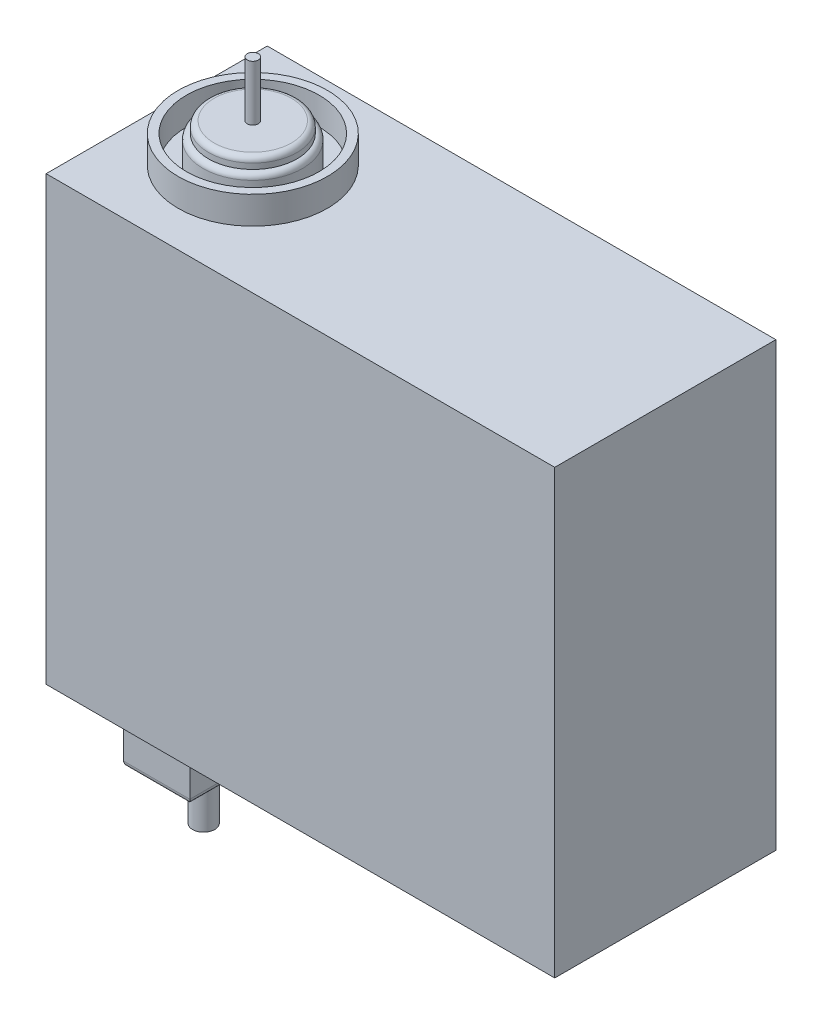
ISO-10303-21;
HEADER;
FILE_DESCRIPTION(('STEP AP214'),'2;1');
FILE_NAME('part.step','',(''),(''),'','','');
FILE_SCHEMA(('AUTOMOTIVE_DESIGN { 1 0 10303 214 1 1 1 1 }'));
ENDSEC;
DATA;
#1=APPLICATION_CONTEXT('core data for automotive mechanical design processes');
#2=APPLICATION_PROTOCOL_DEFINITION('international standard','automotive_design',2000,#1);
#3=PRODUCT_CONTEXT('',#1,'mechanical');
#4=PRODUCT('Part','Part','',(#3));
#5=PRODUCT_RELATED_PRODUCT_CATEGORY('part','',(#4));
#6=PRODUCT_DEFINITION_FORMATION('','',#4);
#7=PRODUCT_DEFINITION_CONTEXT('part definition',#1,'design');
#8=PRODUCT_DEFINITION('design','',#6,#7);
#9=PRODUCT_DEFINITION_SHAPE('','',#8);
#10=(LENGTH_UNIT() NAMED_UNIT(*) SI_UNIT(.MILLI.,.METRE.));
#11=(NAMED_UNIT(*) PLANE_ANGLE_UNIT() SI_UNIT($,.RADIAN.));
#12=(NAMED_UNIT(*) SI_UNIT($,.STERADIAN.) SOLID_ANGLE_UNIT());
#13=UNCERTAINTY_MEASURE_WITH_UNIT(LENGTH_MEASURE(1.E-05),#10,'distance_accuracy_value','');
#14=(GEOMETRIC_REPRESENTATION_CONTEXT(3) GLOBAL_UNCERTAINTY_ASSIGNED_CONTEXT((#13)) GLOBAL_UNIT_ASSIGNED_CONTEXT((#10,
#11,#12)) REPRESENTATION_CONTEXT('',''));
#15=CARTESIAN_POINT('',(0.,0.,0.));
#16=DIRECTION('',(0.,0.,1.));
#17=DIRECTION('',(1.,0.,0.));
#18=AXIS2_PLACEMENT_3D('',#15,#16,#17);
#19=CARTESIAN_POINT('',(0.,-5.,0.));
#20=DIRECTION('',(0.,-1.,0.));
#21=DIRECTION('',(0.,0.,-1.));
#22=AXIS2_PLACEMENT_3D('',#19,#20,#21);
#23=PLANE('',#22);
#24=CARTESIAN_POINT('',(-46.1813750086827,-5.,-13.2208172056496));
#25=DIRECTION('',(0.,-1.,0.));
#26=DIRECTION('',(0.,0.,-1.));
#27=AXIS2_PLACEMENT_3D('',#24,#25,#26);
#28=CIRCLE('',#27,0.999999999999998);
#29=CARTESIAN_POINT('',(-46.1813750086827,-5.,-14.2208172056496));
#30=VERTEX_POINT('',#29);
#31=EDGE_CURVE('E252',#30,#30,#28,.T.);
#32=ORIENTED_EDGE('',*,*,#31,.F.);
#33=EDGE_LOOP('',(#32));
#34=FACE_BOUND('',#33,.T.);
#35=DIRECTION('',(0.,0.,1.));
#36=VECTOR('',#35,1.);
#37=CARTESIAN_POINT('',(-43.6813750086827,-5.,-8.97081720564958));
#38=LINE('',#37,#36);
#39=CARTESIAN_POINT('',(-43.6813750086827,-5.,-24.4708172056496));
#40=VERTEX_POINT('',#39);
#41=CARTESIAN_POINT('',(-43.6813750086827,-5.,-9.47081720564958));
#42=VERTEX_POINT('',#41);
#43=EDGE_CURVE('E218',#40,#42,#38,.T.);
#44=ORIENTED_EDGE('',*,*,#43,.T.);
#45=DIRECTION('',(-1.,0.,0.));
#46=VECTOR('',#45,1.);
#47=CARTESIAN_POINT('',(-49.1813750086827,-5.,-9.47081720564958));
#48=LINE('',#47,#46);
#49=CARTESIAN_POINT('',(-48.6813750086827,-5.,-9.47081720564958));
#50=VERTEX_POINT('',#49);
#51=EDGE_CURVE('E220',#42,#50,#48,.T.);
#52=ORIENTED_EDGE('',*,*,#51,.T.);
#53=DIRECTION('',(0.,0.,-1.));
#54=VECTOR('',#53,1.);
#55=CARTESIAN_POINT('',(-48.6813750086827,-5.,-24.9708172056496));
#56=LINE('',#55,#54);
#57=CARTESIAN_POINT('',(-48.6813750086827,-5.,-24.4708172056496));
#58=VERTEX_POINT('',#57);
#59=EDGE_CURVE('E214',#50,#58,#56,.T.);
#60=ORIENTED_EDGE('',*,*,#59,.T.);
#61=DIRECTION('',(1.,0.,0.));
#62=VECTOR('',#61,1.);
#63=CARTESIAN_POINT('',(-43.1813750086827,-5.,-24.4708172056496));
#64=LINE('',#63,#62);
#65=EDGE_CURVE('E216',#58,#40,#64,.T.);
#66=ORIENTED_EDGE('',*,*,#65,.T.);
#67=EDGE_LOOP('',(#44,#52,#60,#66));
#68=FACE_BOUND('',#67,.T.);
#69=CARTESIAN_POINT('',(-46.1813750086827,-5.,-20.7208172056496));
#70=DIRECTION('',(0.,-1.,0.));
#71=DIRECTION('',(0.,0.,-1.));
#72=AXIS2_PLACEMENT_3D('',#69,#70,#71);
#73=CIRCLE('',#72,0.999999999999998);
#74=CARTESIAN_POINT('',(-46.1813750086827,-5.,-21.7208172056496));
#75=VERTEX_POINT('',#74);
#76=EDGE_CURVE('E258',#75,#75,#73,.T.);
#77=ORIENTED_EDGE('',*,*,#76,.F.);
#78=EDGE_LOOP('',(#77));
#79=FACE_BOUND('',#78,.T.);
#80=ADVANCED_FACE('F41',(#34,#68,#79),#23,.T.);
#81=CARTESIAN_POINT('',(0.,0.,0.));
#82=DIRECTION('',(0.,1.,0.));
#83=DIRECTION('',(0.,0.,1.));
#84=AXIS2_PLACEMENT_3D('',#81,#82,#83);
#85=PLANE('',#84);
#86=DIRECTION('',(0.,0.,1.));
#87=VECTOR('',#86,1.);
#88=CARTESIAN_POINT('',(-54.1813750086827,0.,-26.9708172056496));
#89=LINE('',#88,#87);
#90=CARTESIAN_POINT('',(-54.1813750086827,0.,-26.9708172056496));
#91=VERTEX_POINT('',#90);
#92=CARTESIAN_POINT('',(-54.1813750086827,0.,-6.97081720564958));
#93=VERTEX_POINT('',#92);
#94=EDGE_CURVE('E172',#91,#93,#89,.T.);
#95=ORIENTED_EDGE('',*,*,#94,.F.);
#96=DIRECTION('',(-1.,0.,0.));
#97=VECTOR('',#96,1.);
#98=CARTESIAN_POINT('',(-54.1813750086827,0.,-26.9708172056496));
#99=LINE('',#98,#97);
#100=CARTESIAN_POINT('',(-8.18137500868274,0.,-26.9708172056496));
#101=VERTEX_POINT('',#100);
#102=EDGE_CURVE('E177',#101,#91,#99,.T.);
#103=ORIENTED_EDGE('',*,*,#102,.F.);
#104=DIRECTION('',(0.,0.,-1.));
#105=VECTOR('',#104,1.);
#106=CARTESIAN_POINT('',(-8.18137500868274,0.,-26.9708172056496));
#107=LINE('',#106,#105);
#108=CARTESIAN_POINT('',(-8.18137500868273,0.,-6.97081720564958));
#109=VERTEX_POINT('',#108);
#110=EDGE_CURVE('E188',#109,#101,#107,.T.);
#111=ORIENTED_EDGE('',*,*,#110,.F.);
#112=DIRECTION('',(1.,0.,0.));
#113=VECTOR('',#112,1.);
#114=CARTESIAN_POINT('',(-54.1813750086827,0.,-6.97081720564958));
#115=LINE('',#114,#113);
#116=EDGE_CURVE('E186',#93,#109,#115,.T.);
#117=ORIENTED_EDGE('',*,*,#116,.F.);
#118=EDGE_LOOP('',(#95,#103,#111,#117));
#119=FACE_BOUND('',#118,.T.);
#120=DIRECTION('',(0.,0.,-1.));
#121=VECTOR('',#120,1.);
#122=CARTESIAN_POINT('',(-49.1813750086827,0.,-8.97081720564958));
#123=LINE('',#122,#121);
#124=CARTESIAN_POINT('',(-49.1813750086827,0.,-8.97081720564958));
#125=VERTEX_POINT('',#124);
#126=CARTESIAN_POINT('',(-49.1813750086827,0.,-24.9708172056496));
#127=VERTEX_POINT('',#126);
#128=EDGE_CURVE('E122',#125,#127,#123,.T.);
#129=ORIENTED_EDGE('',*,*,#128,.F.);
#130=DIRECTION('',(-1.,0.,0.));
#131=VECTOR('',#130,1.);
#132=CARTESIAN_POINT('',(-49.1813750086827,0.,-8.97081720564958));
#133=LINE('',#132,#131);
#134=CARTESIAN_POINT('',(-43.1813750086827,0.,-8.97081720564958));
#135=VERTEX_POINT('',#134);
#136=EDGE_CURVE('E129',#135,#125,#133,.T.);
#137=ORIENTED_EDGE('',*,*,#136,.F.);
#138=DIRECTION('',(0.,0.,1.));
#139=VECTOR('',#138,1.);
#140=CARTESIAN_POINT('',(-43.1813750086827,0.,-8.97081720564958));
#141=LINE('',#140,#139);
#142=CARTESIAN_POINT('',(-43.1813750086827,0.,-24.9708172056496));
#143=VERTEX_POINT('',#142);
#144=EDGE_CURVE('E141',#143,#135,#141,.T.);
#145=ORIENTED_EDGE('',*,*,#144,.F.);
#146=DIRECTION('',(1.,0.,0.));
#147=VECTOR('',#146,1.);
#148=CARTESIAN_POINT('',(-49.1813750086827,0.,-24.9708172056496));
#149=LINE('',#148,#147);
#150=EDGE_CURVE('E138',#127,#143,#149,.T.);
#151=ORIENTED_EDGE('',*,*,#150,.F.);
#152=EDGE_LOOP('',(#129,#137,#145,#151));
#153=FACE_BOUND('',#152,.T.);
#154=ADVANCED_FACE('F134',(#119,#153),#85,.F.);
#155=CARTESIAN_POINT('',(-45.4895583516191,43.5,-16.9708172056496));
#156=DIRECTION('',(0.,1.,0.));
#157=DIRECTION('',(0.,0.,1.));
#158=AXIS2_PLACEMENT_3D('',#155,#156,#157);
#159=PLANE('',#158);
#160=CARTESIAN_POINT('',(-45.4895583516191,43.5,-16.9708172056496));
#161=DIRECTION('',(0.,1.,0.));
#162=DIRECTION('',(0.,0.,1.));
#163=AXIS2_PLACEMENT_3D('',#160,#161,#162);
#164=CIRCLE('',#163,3.50000000000001);
#165=CARTESIAN_POINT('',(-45.4895583516191,43.5,-13.4708172056496));
#166=VERTEX_POINT('',#165);
#167=EDGE_CURVE('E205',#166,#166,#164,.T.);
#168=ORIENTED_EDGE('',*,*,#167,.T.);
#169=EDGE_LOOP('',(#168));
#170=FACE_BOUND('',#169,.T.);
#171=CARTESIAN_POINT('',(-45.4895583516191,43.5,-16.9708172056496));
#172=DIRECTION('',(0.,1.,0.));
#173=DIRECTION('',(0.,0.,1.));
#174=AXIS2_PLACEMENT_3D('',#171,#172,#173);
#175=CIRCLE('',#174,0.499999999999999);
#176=CARTESIAN_POINT('',(-45.4895583516191,43.5,-16.4708172056496));
#177=VERTEX_POINT('',#176);
#178=EDGE_CURVE('E151',#177,#177,#175,.T.);
#179=ORIENTED_EDGE('',*,*,#178,.F.);
#180=EDGE_LOOP('',(#179));
#181=FACE_BOUND('',#180,.T.);
#182=ADVANCED_FACE('F279',(#170,#181),#159,.T.);
#183=CARTESIAN_POINT('',(0.,40.,0.));
#184=DIRECTION('',(0.,1.,0.));
#185=DIRECTION('',(0.,0.,1.));
#186=AXIS2_PLACEMENT_3D('',#183,#184,#185);
#187=PLANE('',#186);
#188=CARTESIAN_POINT('',(-45.4895583516191,40.,-16.9708172056496));
#189=DIRECTION('',(0.,1.,0.));
#190=DIRECTION('',(0.,0.,1.));
#191=AXIS2_PLACEMENT_3D('',#188,#189,#190);
#192=CIRCLE('',#191,6.);
#193=CARTESIAN_POINT('',(-45.4895583516191,40.,-10.9708172056496));
#194=VERTEX_POINT('',#193);
#195=EDGE_CURVE('E202',#194,#194,#192,.F.);
#196=ORIENTED_EDGE('',*,*,#195,.F.);
#197=EDGE_LOOP('',(#196));
#198=FACE_BOUND('',#197,.T.);
#199=CARTESIAN_POINT('',(-45.4895583516191,40.,-16.9708172056496));
#200=DIRECTION('',(0.,1.,0.));
#201=DIRECTION('',(0.,0.,1.));
#202=AXIS2_PLACEMENT_3D('',#199,#200,#201);
#203=CIRCLE('',#202,4.5);
#204=CARTESIAN_POINT('',(-45.4895583516191,40.,-12.4708172056496));
#205=VERTEX_POINT('',#204);
#206=EDGE_CURVE('E167',#205,#205,#203,.T.);
#207=ORIENTED_EDGE('',*,*,#206,.F.);
#208=EDGE_LOOP('',(#207));
#209=FACE_BOUND('',#208,.T.);
#210=ADVANCED_FACE('F307',(#198,#209),#187,.T.);
#211=CARTESIAN_POINT('',(-45.4895583516191,42.5,-16.9708172056496));
#212=DIRECTION('',(0.,-1.,0.));
#213=DIRECTION('',(0.,0.,-1.));
#214=AXIS2_PLACEMENT_3D('',#211,#212,#213);
#215=CYLINDRICAL_SURFACE('',#214,4.5);
#216=CARTESIAN_POINT('',(-45.4895583516191,42.,-16.9708172056496));
#217=DIRECTION('',(0.,1.,0.));
#218=DIRECTION('',(0.,0.,1.));
#219=AXIS2_PLACEMENT_3D('',#216,#217,#218);
#220=CIRCLE('',#219,4.5);
#221=CARTESIAN_POINT('',(-45.4895583516191,42.,-12.4708172056496));
#222=VERTEX_POINT('',#221);
#223=EDGE_CURVE('E211',#222,#222,#220,.F.);
#224=ORIENTED_EDGE('',*,*,#223,.T.);
#225=EDGE_LOOP('',(#224));
#226=FACE_BOUND('',#225,.T.);
#227=ORIENTED_EDGE('',*,*,#206,.T.);
#228=EDGE_LOOP('',(#227));
#229=FACE_BOUND('',#228,.T.);
#230=ADVANCED_FACE('F327',(#226,#229),#215,.T.);
#231=CARTESIAN_POINT('',(-45.4895583516191,42.5,-16.9708172056496));
#232=DIRECTION('',(0.,-1.,0.));
#233=DIRECTION('',(0.,0.,-1.));
#234=AXIS2_PLACEMENT_3D('',#231,#232,#233);
#235=CYLINDRICAL_SURFACE('',#234,6.);
#236=CARTESIAN_POINT('',(-45.4895583516191,42.5,-16.9708172056496));
#237=DIRECTION('',(0.,1.,0.));
#238=DIRECTION('',(0.,0.,1.));
#239=AXIS2_PLACEMENT_3D('',#236,#237,#238);
#240=CIRCLE('',#239,6.);
#241=CARTESIAN_POINT('',(-45.4895583516191,42.5,-10.9708172056496));
#242=VERTEX_POINT('',#241);
#243=EDGE_CURVE('E161',#242,#242,#240,.T.);
#244=ORIENTED_EDGE('',*,*,#243,.T.);
#245=EDGE_LOOP('',(#244));
#246=FACE_BOUND('',#245,.T.);
#247=ORIENTED_EDGE('',*,*,#195,.T.);
#248=EDGE_LOOP('',(#247));
#249=FACE_BOUND('',#248,.T.);
#250=ADVANCED_FACE('F323',(#246,#249),#235,.F.);
#251=CARTESIAN_POINT('',(-45.4895583516191,42.5,-16.9708172056496));
#252=DIRECTION('',(0.,-1.,0.));
#253=DIRECTION('',(0.,0.,-1.));
#254=AXIS2_PLACEMENT_3D('',#251,#252,#253);
#255=CYLINDRICAL_SURFACE('',#254,6.75);
#256=CARTESIAN_POINT('',(-45.4895583516191,42.5,-16.9708172056496));
#257=DIRECTION('',(0.,1.,0.));
#258=DIRECTION('',(0.,0.,1.));
#259=AXIS2_PLACEMENT_3D('',#256,#257,#258);
#260=CIRCLE('',#259,6.75);
#261=CARTESIAN_POINT('',(-45.4895583516191,42.5,-10.2208172056496));
#262=VERTEX_POINT('',#261);
#263=EDGE_CURVE('E164',#262,#262,#260,.T.);
#264=ORIENTED_EDGE('',*,*,#263,.F.);
#265=EDGE_LOOP('',(#264));
#266=FACE_BOUND('',#265,.T.);
#267=CARTESIAN_POINT('',(-45.4895583516191,40.,-16.9708172056496));
#268=DIRECTION('',(0.,1.,0.));
#269=DIRECTION('',(0.,0.,1.));
#270=AXIS2_PLACEMENT_3D('',#267,#268,#269);
#271=CIRCLE('',#270,6.75);
#272=CARTESIAN_POINT('',(-45.4895583516191,40.,-10.2208172056496));
#273=VERTEX_POINT('',#272);
#274=EDGE_CURVE('E160',#273,#273,#271,.T.);
#275=ORIENTED_EDGE('',*,*,#274,.T.);
#276=EDGE_LOOP('',(#275));
#277=FACE_BOUND('',#276,.T.);
#278=ADVANCED_FACE('F319',(#266,#277),#255,.T.);
#279=CARTESIAN_POINT('',(0.,42.5,0.));
#280=DIRECTION('',(0.,1.,0.));
#281=DIRECTION('',(0.,0.,1.));
#282=AXIS2_PLACEMENT_3D('',#279,#280,#281);
#283=PLANE('',#282);
#284=ORIENTED_EDGE('',*,*,#243,.F.);
#285=EDGE_LOOP('',(#284));
#286=FACE_BOUND('',#285,.T.);
#287=ORIENTED_EDGE('',*,*,#263,.T.);
#288=EDGE_LOOP('',(#287));
#289=FACE_BOUND('',#288,.T.);
#290=ADVANCED_FACE('F315',(#286,#289),#283,.T.);
#291=CARTESIAN_POINT('',(-54.1813750086827,40.,-26.9708172056496));
#292=DIRECTION('',(0.,0.,1.));
#293=DIRECTION('',(1.,0.,0.));
#294=AXIS2_PLACEMENT_3D('',#291,#292,#293);
#295=PLANE('',#294);
#296=ORIENTED_EDGE('',*,*,#102,.T.);
#297=DIRECTION('',(0.,-1.,0.));
#298=VECTOR('',#297,1.);
#299=CARTESIAN_POINT('',(-54.1813750086827,40.,-26.9708172056496));
#300=LINE('',#299,#298);
#301=CARTESIAN_POINT('',(-54.1813750086827,40.,-26.9708172056496));
#302=VERTEX_POINT('',#301);
#303=EDGE_CURVE('E183',#302,#91,#300,.T.);
#304=ORIENTED_EDGE('',*,*,#303,.F.);
#305=DIRECTION('',(-1.,0.,0.));
#306=VECTOR('',#305,1.);
#307=CARTESIAN_POINT('',(-54.1813750086827,40.,-26.9708172056496));
#308=LINE('',#307,#306);
#309=CARTESIAN_POINT('',(-8.18137500868274,40.,-26.9708172056496));
#310=VERTEX_POINT('',#309);
#311=EDGE_CURVE('E181',#310,#302,#308,.T.);
#312=ORIENTED_EDGE('',*,*,#311,.F.);
#313=DIRECTION('',(0.,-1.,0.));
#314=VECTOR('',#313,1.);
#315=CARTESIAN_POINT('',(-8.18137500868274,40.,-26.9708172056496));
#316=LINE('',#315,#314);
#317=EDGE_CURVE('E193',#310,#101,#316,.T.);
#318=ORIENTED_EDGE('',*,*,#317,.T.);
#319=EDGE_LOOP('',(#296,#304,#312,#318));
#320=FACE_BOUND('',#319,.T.);
#321=ADVANCED_FACE('F318',(#320),#295,.F.);
#322=CARTESIAN_POINT('',(-8.18137500868274,40.,-26.9708172056496));
#323=DIRECTION('',(-1.,0.,0.));
#324=DIRECTION('',(0.,0.,1.));
#325=AXIS2_PLACEMENT_3D('',#322,#323,#324);
#326=PLANE('',#325);
#327=ORIENTED_EDGE('',*,*,#110,.T.);
#328=ORIENTED_EDGE('',*,*,#317,.F.);
#329=DIRECTION('',(0.,0.,-1.));
#330=VECTOR('',#329,1.);
#331=CARTESIAN_POINT('',(-8.18137500868274,40.,-26.9708172056496));
#332=LINE('',#331,#330);
#333=CARTESIAN_POINT('',(-8.18137500868273,40.,-6.97081720564958));
#334=VERTEX_POINT('',#333);
#335=EDGE_CURVE('E179',#334,#310,#332,.T.);
#336=ORIENTED_EDGE('',*,*,#335,.F.);
#337=DIRECTION('',(0.,-1.,0.));
#338=VECTOR('',#337,1.);
#339=CARTESIAN_POINT('',(-8.18137500868273,40.,-6.97081720564958));
#340=LINE('',#339,#338);
#341=EDGE_CURVE('E196',#334,#109,#340,.T.);
#342=ORIENTED_EDGE('',*,*,#341,.T.);
#343=EDGE_LOOP('',(#327,#328,#336,#342));
#344=FACE_BOUND('',#343,.T.);
#345=ADVANCED_FACE('F337',(#344),#326,.F.);
#346=CARTESIAN_POINT('',(-54.1813750086827,40.,-6.97081720564958));
#347=DIRECTION('',(0.,0.,-1.));
#348=DIRECTION('',(-1.,0.,0.));
#349=AXIS2_PLACEMENT_3D('',#346,#347,#348);
#350=PLANE('',#349);
#351=ORIENTED_EDGE('',*,*,#116,.T.);
#352=ORIENTED_EDGE('',*,*,#341,.F.);
#353=DIRECTION('',(1.,0.,0.));
#354=VECTOR('',#353,1.);
#355=CARTESIAN_POINT('',(-54.1813750086827,40.,-6.97081720564958));
#356=LINE('',#355,#354);
#357=CARTESIAN_POINT('',(-54.1813750086827,40.,-6.97081720564958));
#358=VERTEX_POINT('',#357);
#359=EDGE_CURVE('E176',#358,#334,#356,.T.);
#360=ORIENTED_EDGE('',*,*,#359,.F.);
#361=DIRECTION('',(0.,-1.,0.));
#362=VECTOR('',#361,1.);
#363=CARTESIAN_POINT('',(-54.1813750086827,40.,-6.97081720564958));
#364=LINE('',#363,#362);
#365=EDGE_CURVE('E199',#358,#93,#364,.T.);
#366=ORIENTED_EDGE('',*,*,#365,.T.);
#367=EDGE_LOOP('',(#351,#352,#360,#366));
#368=FACE_BOUND('',#367,.T.);
#369=ADVANCED_FACE('F341',(#368),#350,.F.);
#370=CARTESIAN_POINT('',(-54.1813750086827,40.,-26.9708172056496));
#371=DIRECTION('',(1.,0.,0.));
#372=DIRECTION('',(0.,0.,-1.));
#373=AXIS2_PLACEMENT_3D('',#370,#371,#372);
#374=PLANE('',#373);
#375=ORIENTED_EDGE('',*,*,#94,.T.);
#376=ORIENTED_EDGE('',*,*,#365,.F.);
#377=DIRECTION('',(0.,0.,1.));
#378=VECTOR('',#377,1.);
#379=CARTESIAN_POINT('',(-54.1813750086827,40.,-26.9708172056496));
#380=LINE('',#379,#378);
#381=EDGE_CURVE('E173',#302,#358,#380,.T.);
#382=ORIENTED_EDGE('',*,*,#381,.F.);
#383=ORIENTED_EDGE('',*,*,#303,.T.);
#384=EDGE_LOOP('',(#375,#376,#382,#383));
#385=FACE_BOUND('',#384,.T.);
#386=ADVANCED_FACE('F345',(#385),#374,.F.);
#387=ORIENTED_EDGE('',*,*,#381,.T.);
#388=ORIENTED_EDGE('',*,*,#359,.T.);
#389=ORIENTED_EDGE('',*,*,#335,.T.);
#390=ORIENTED_EDGE('',*,*,#311,.T.);
#391=EDGE_LOOP('',(#387,#388,#389,#390));
#392=FACE_BOUND('',#391,.T.);
#393=ORIENTED_EDGE('',*,*,#274,.F.);
#394=EDGE_LOOP('',(#393));
#395=FACE_BOUND('',#394,.T.);
#396=ADVANCED_FACE('F313',(#392,#395),#187,.T.);
#397=CARTESIAN_POINT('',(-45.4895583516191,43.5,-16.9708172056496));
#398=DIRECTION('',(0.,-1.,0.));
#399=DIRECTION('',(0.,0.,-1.));
#400=AXIS2_PLACEMENT_3D('',#397,#398,#399);
#401=CYLINDRICAL_SURFACE('',#400,4.00000000000001);
#402=CARTESIAN_POINT('',(-45.4895583516191,43.,-16.9708172056496));
#403=DIRECTION('',(0.,1.,0.));
#404=DIRECTION('',(0.,0.,1.));
#405=AXIS2_PLACEMENT_3D('',#402,#403,#404);
#406=CIRCLE('',#405,4.00000000000001);
#407=CARTESIAN_POINT('',(-45.4895583516191,43.,-12.9708172056496));
#408=VERTEX_POINT('',#407);
#409=EDGE_CURVE('E208',#408,#408,#406,.F.);
#410=ORIENTED_EDGE('',*,*,#409,.T.);
#411=EDGE_LOOP('',(#410));
#412=FACE_BOUND('',#411,.T.);
#413=CARTESIAN_POINT('',(-45.4895583516191,42.5,-16.9708172056496));
#414=DIRECTION('',(0.,1.,0.));
#415=DIRECTION('',(0.,0.,1.));
#416=AXIS2_PLACEMENT_3D('',#413,#414,#415);
#417=CIRCLE('',#416,4.00000000000001);
#418=CARTESIAN_POINT('',(-45.4895583516191,42.5,-12.9708172056496));
#419=VERTEX_POINT('',#418);
#420=EDGE_CURVE('E155',#419,#419,#417,.T.);
#421=ORIENTED_EDGE('',*,*,#420,.T.);
#422=EDGE_LOOP('',(#421));
#423=FACE_BOUND('',#422,.T.);
#424=ADVANCED_FACE('F309',(#412,#423),#401,.T.);
#425=CARTESIAN_POINT('',(-45.4895583516191,43.,-16.9708172056496));
#426=DIRECTION('',(0.,1.,0.));
#427=DIRECTION('',(0.,0.,1.));
#428=AXIS2_PLACEMENT_3D('',#425,#426,#427);
#429=TOROIDAL_SURFACE('',#428,3.50000000000001,0.5);
#430=ORIENTED_EDGE('',*,*,#409,.F.);
#431=EDGE_LOOP('',(#430));
#432=FACE_BOUND('',#431,.T.);
#433=ORIENTED_EDGE('',*,*,#167,.F.);
#434=EDGE_LOOP('',(#433));
#435=FACE_BOUND('',#434,.T.);
#436=ADVANCED_FACE('F312',(#432,#435),#429,.T.);
#437=CARTESIAN_POINT('',(-45.4895583516191,42.,-16.9708172056496));
#438=DIRECTION('',(0.,1.,0.));
#439=DIRECTION('',(0.,0.,1.));
#440=AXIS2_PLACEMENT_3D('',#437,#438,#439);
#441=TOROIDAL_SURFACE('',#440,4.,0.5);
#442=ORIENTED_EDGE('',*,*,#223,.F.);
#443=EDGE_LOOP('',(#442));
#444=FACE_BOUND('',#443,.T.);
#445=ORIENTED_EDGE('',*,*,#420,.F.);
#446=EDGE_LOOP('',(#445));
#447=FACE_BOUND('',#446,.T.);
#448=ADVANCED_FACE('F303',(#444,#447),#441,.T.);
#449=CARTESIAN_POINT('',(-45.4895583516191,48.5,-16.9708172056496));
#450=DIRECTION('',(0.,-1.,0.));
#451=DIRECTION('',(0.,0.,-1.));
#452=AXIS2_PLACEMENT_3D('',#449,#450,#451);
#453=CYLINDRICAL_SURFACE('',#452,0.499999999999999);
#454=CARTESIAN_POINT('',(-45.4895583516191,48.5,-16.9708172056496));
#455=DIRECTION('',(0.,1.,0.));
#456=DIRECTION('',(0.,0.,1.));
#457=AXIS2_PLACEMENT_3D('',#454,#455,#456);
#458=CIRCLE('',#457,0.499999999999999);
#459=CARTESIAN_POINT('',(-45.4895583516191,48.5,-16.4708172056496));
#460=VERTEX_POINT('',#459);
#461=EDGE_CURVE('E152',#460,#460,#458,.T.);
#462=ORIENTED_EDGE('',*,*,#461,.F.);
#463=EDGE_LOOP('',(#462));
#464=FACE_BOUND('',#463,.T.);
#465=ORIENTED_EDGE('',*,*,#178,.T.);
#466=EDGE_LOOP('',(#465));
#467=FACE_BOUND('',#466,.T.);
#468=ADVANCED_FACE('F299',(#464,#467),#453,.T.);
#469=CARTESIAN_POINT('',(-45.4895583516191,48.5,-16.9708172056496));
#470=DIRECTION('',(0.,1.,0.));
#471=DIRECTION('',(0.,0.,1.));
#472=AXIS2_PLACEMENT_3D('',#469,#470,#471);
#473=PLANE('',#472);
#474=ORIENTED_EDGE('',*,*,#461,.T.);
#475=EDGE_LOOP('',(#474));
#476=FACE_BOUND('',#475,.T.);
#477=ADVANCED_FACE('F296',(#476),#473,.T.);
#478=CARTESIAN_POINT('',(-49.1813750086827,-5.,-8.97081720564958));
#479=DIRECTION('',(1.,0.,0.));
#480=DIRECTION('',(0.,0.,-1.));
#481=AXIS2_PLACEMENT_3D('',#478,#479,#480);
#482=PLANE('',#481);
#483=DIRECTION('',(0.,1.,0.));
#484=VECTOR('',#483,1.);
#485=CARTESIAN_POINT('',(-49.1813750086827,-5.,-24.9708172056496));
#486=LINE('',#485,#484);
#487=CARTESIAN_POINT('',(-49.1813750086827,-4.5,-24.9708172056496));
#488=VERTEX_POINT('',#487);
#489=EDGE_CURVE('E149',#488,#127,#486,.T.);
#490=ORIENTED_EDGE('',*,*,#489,.F.);
#491=DIRECTION('',(0.,0.,-1.));
#492=VECTOR('',#491,1.);
#493=CARTESIAN_POINT('',(-49.1813750086827,-4.5,-8.97081720564958));
#494=LINE('',#493,#492);
#495=CARTESIAN_POINT('',(-49.1813750086827,-4.5,-8.97081720564958));
#496=VERTEX_POINT('',#495);
#497=EDGE_CURVE('E12',#488,#496,#494,.F.);
#498=ORIENTED_EDGE('',*,*,#497,.T.);
#499=DIRECTION('',(0.,1.,0.));
#500=VECTOR('',#499,1.);
#501=CARTESIAN_POINT('',(-49.1813750086827,-5.,-8.97081720564958));
#502=LINE('',#501,#500);
#503=EDGE_CURVE('E119',#496,#125,#502,.T.);
#504=ORIENTED_EDGE('',*,*,#503,.T.);
#505=ORIENTED_EDGE('',*,*,#128,.T.);
#506=EDGE_LOOP('',(#490,#498,#504,#505));
#507=FACE_BOUND('',#506,.T.);
#508=ADVANCED_FACE('F121',(#507),#482,.F.);
#509=CARTESIAN_POINT('',(-49.1813750086827,-5.,-24.9708172056496));
#510=DIRECTION('',(0.,0.,1.));
#511=DIRECTION('',(1.,0.,0.));
#512=AXIS2_PLACEMENT_3D('',#509,#510,#511);
#513=PLANE('',#512);
#514=DIRECTION('',(0.,1.,0.));
#515=VECTOR('',#514,1.);
#516=CARTESIAN_POINT('',(-43.1813750086827,-5.,-24.9708172056496));
#517=LINE('',#516,#515);
#518=CARTESIAN_POINT('',(-43.1813750086827,-4.5,-24.9708172056496));
#519=VERTEX_POINT('',#518);
#520=EDGE_CURVE('E147',#519,#143,#517,.T.);
#521=ORIENTED_EDGE('',*,*,#520,.F.);
#522=DIRECTION('',(1.,0.,0.));
#523=VECTOR('',#522,1.);
#524=CARTESIAN_POINT('',(-49.1813750086827,-4.5,-24.9708172056496));
#525=LINE('',#524,#523);
#526=EDGE_CURVE('E50',#519,#488,#525,.F.);
#527=ORIENTED_EDGE('',*,*,#526,.T.);
#528=ORIENTED_EDGE('',*,*,#489,.T.);
#529=ORIENTED_EDGE('',*,*,#150,.T.);
#530=EDGE_LOOP('',(#521,#527,#528,#529));
#531=FACE_BOUND('',#530,.T.);
#532=ADVANCED_FACE('F250',(#531),#513,.F.);
#533=CARTESIAN_POINT('',(-43.1813750086827,-5.,-8.97081720564958));
#534=DIRECTION('',(-1.,0.,0.));
#535=DIRECTION('',(0.,0.,1.));
#536=AXIS2_PLACEMENT_3D('',#533,#534,#535);
#537=PLANE('',#536);
#538=DIRECTION('',(0.,1.,0.));
#539=VECTOR('',#538,1.);
#540=CARTESIAN_POINT('',(-43.1813750086827,-5.,-8.97081720564958));
#541=LINE('',#540,#539);
#542=CARTESIAN_POINT('',(-43.1813750086827,-4.5,-8.97081720564958));
#543=VERTEX_POINT('',#542);
#544=EDGE_CURVE('E128',#543,#135,#541,.T.);
#545=ORIENTED_EDGE('',*,*,#544,.F.);
#546=DIRECTION('',(0.,0.,1.));
#547=VECTOR('',#546,1.);
#548=CARTESIAN_POINT('',(-43.1813750086827,-4.5,-24.9708172056496));
#549=LINE('',#548,#547);
#550=EDGE_CURVE('E65',#543,#519,#549,.F.);
#551=ORIENTED_EDGE('',*,*,#550,.T.);
#552=ORIENTED_EDGE('',*,*,#520,.T.);
#553=ORIENTED_EDGE('',*,*,#144,.T.);
#554=EDGE_LOOP('',(#545,#551,#552,#553));
#555=FACE_BOUND('',#554,.T.);
#556=ADVANCED_FACE('F249',(#555),#537,.F.);
#557=CARTESIAN_POINT('',(-49.1813750086827,-5.,-8.97081720564958));
#558=DIRECTION('',(0.,0.,-1.));
#559=DIRECTION('',(-1.,0.,0.));
#560=AXIS2_PLACEMENT_3D('',#557,#558,#559);
#561=PLANE('',#560);
#562=ORIENTED_EDGE('',*,*,#503,.F.);
#563=DIRECTION('',(-1.,0.,0.));
#564=VECTOR('',#563,1.);
#565=CARTESIAN_POINT('',(-43.1813750086827,-4.5,-8.97081720564958));
#566=LINE('',#565,#564);
#567=EDGE_CURVE('E223',#496,#543,#566,.F.);
#568=ORIENTED_EDGE('',*,*,#567,.T.);
#569=ORIENTED_EDGE('',*,*,#544,.T.);
#570=ORIENTED_EDGE('',*,*,#136,.T.);
#571=EDGE_LOOP('',(#562,#568,#569,#570));
#572=FACE_BOUND('',#571,.T.);
#573=ADVANCED_FACE('F140',(#572),#561,.F.);
#574=CARTESIAN_POINT('',(0.,-4.5,-24.4708172056496));
#575=DIRECTION('',(-1.,0.,0.));
#576=DIRECTION('',(0.,0.,1.));
#577=AXIS2_PLACEMENT_3D('',#574,#575,#576);
#578=CYLINDRICAL_SURFACE('',#577,0.5);
#579=CARTESIAN_POINT('',(-48.6813750086827,-4.5,-24.4708172056496));
#580=DIRECTION('',(-0.707106781186547,0.,0.707106781186547));
#581=DIRECTION('',(0.707106781186547,0.,0.707106781186547));
#582=AXIS2_PLACEMENT_3D('',#579,#580,#581);
#583=ELLIPSE('',#582,0.707106781186547,0.5);
#584=EDGE_CURVE('E231',#488,#58,#583,.T.);
#585=ORIENTED_EDGE('',*,*,#584,.F.);
#586=ORIENTED_EDGE('',*,*,#526,.F.);
#587=CARTESIAN_POINT('',(-43.6813750086827,-4.5,-24.4708172056496));
#588=DIRECTION('',(-0.707106781186547,0.,-0.707106781186547));
#589=DIRECTION('',(-0.707106781186547,0.,0.707106781186547));
#590=AXIS2_PLACEMENT_3D('',#587,#588,#589);
#591=ELLIPSE('',#590,0.707106781186547,0.5);
#592=EDGE_CURVE('E45',#40,#519,#591,.F.);
#593=ORIENTED_EDGE('',*,*,#592,.F.);
#594=ORIENTED_EDGE('',*,*,#65,.F.);
#595=EDGE_LOOP('',(#585,#586,#593,#594));
#596=FACE_BOUND('',#595,.T.);
#597=ADVANCED_FACE('F43',(#596),#578,.T.);
#598=CARTESIAN_POINT('',(-43.6813750086827,-4.5,0.));
#599=DIRECTION('',(0.,0.,-1.));
#600=DIRECTION('',(-1.,0.,0.));
#601=AXIS2_PLACEMENT_3D('',#598,#599,#600);
#602=CYLINDRICAL_SURFACE('',#601,0.5);
#603=ORIENTED_EDGE('',*,*,#592,.T.);
#604=ORIENTED_EDGE('',*,*,#550,.F.);
#605=CARTESIAN_POINT('',(-43.6813750086827,-4.5,-9.47081720564958));
#606=DIRECTION('',(0.707106781186547,0.,-0.707106781186547));
#607=DIRECTION('',(-0.707106781186547,0.,-0.707106781186547));
#608=AXIS2_PLACEMENT_3D('',#605,#606,#607);
#609=ELLIPSE('',#608,0.707106781186547,0.5);
#610=EDGE_CURVE('E229',#42,#543,#609,.F.);
#611=ORIENTED_EDGE('',*,*,#610,.F.);
#612=ORIENTED_EDGE('',*,*,#43,.F.);
#613=EDGE_LOOP('',(#603,#604,#611,#612));
#614=FACE_BOUND('',#613,.T.);
#615=ADVANCED_FACE('F240',(#614),#602,.T.);
#616=CARTESIAN_POINT('',(-48.6813750086827,-4.5,0.));
#617=DIRECTION('',(0.,0.,1.));
#618=DIRECTION('',(1.,0.,0.));
#619=AXIS2_PLACEMENT_3D('',#616,#617,#618);
#620=CYLINDRICAL_SURFACE('',#619,0.5);
#621=ORIENTED_EDGE('',*,*,#584,.T.);
#622=ORIENTED_EDGE('',*,*,#59,.F.);
#623=CARTESIAN_POINT('',(-48.6813750086827,-4.5,-9.47081720564958));
#624=DIRECTION('',(0.707106781186547,0.,0.707106781186547));
#625=DIRECTION('',(-0.707106781186547,0.,0.707106781186547));
#626=AXIS2_PLACEMENT_3D('',#623,#624,#625);
#627=ELLIPSE('',#626,0.707106781186547,0.5);
#628=EDGE_CURVE('E227',#496,#50,#627,.T.);
#629=ORIENTED_EDGE('',*,*,#628,.F.);
#630=ORIENTED_EDGE('',*,*,#497,.F.);
#631=EDGE_LOOP('',(#621,#622,#629,#630));
#632=FACE_BOUND('',#631,.T.);
#633=ADVANCED_FACE('F245',(#632),#620,.T.);
#634=CARTESIAN_POINT('',(0.,-4.5,-9.47081720564958));
#635=DIRECTION('',(1.,0.,0.));
#636=DIRECTION('',(0.,0.,-1.));
#637=AXIS2_PLACEMENT_3D('',#634,#635,#636);
#638=CYLINDRICAL_SURFACE('',#637,0.5);
#639=ORIENTED_EDGE('',*,*,#610,.T.);
#640=ORIENTED_EDGE('',*,*,#567,.F.);
#641=ORIENTED_EDGE('',*,*,#628,.T.);
#642=ORIENTED_EDGE('',*,*,#51,.F.);
#643=EDGE_LOOP('',(#639,#640,#641,#642));
#644=FACE_BOUND('',#643,.T.);
#645=ADVANCED_FACE('F248',(#644),#638,.T.);
#646=CARTESIAN_POINT('',(-46.1813750086827,-10.,-13.2208172056496));
#647=DIRECTION('',(0.,1.,0.));
#648=DIRECTION('',(0.,0.,1.));
#649=AXIS2_PLACEMENT_3D('',#646,#647,#648);
#650=CYLINDRICAL_SURFACE('',#649,0.999999999999998);
#651=CARTESIAN_POINT('',(-46.1813750086827,-10.,-13.2208172056496));
#652=DIRECTION('',(0.,-1.,0.));
#653=DIRECTION('',(0.,0.,-1.));
#654=AXIS2_PLACEMENT_3D('',#651,#652,#653);
#655=CIRCLE('',#654,0.999999999999998);
#656=CARTESIAN_POINT('',(-46.1813750086827,-10.,-14.2208172056496));
#657=VERTEX_POINT('',#656);
#658=EDGE_CURVE('E230',#657,#657,#655,.T.);
#659=ORIENTED_EDGE('',*,*,#658,.F.);
#660=EDGE_LOOP('',(#659));
#661=FACE_BOUND('',#660,.T.);
#662=ORIENTED_EDGE('',*,*,#31,.T.);
#663=EDGE_LOOP('',(#662));
#664=FACE_BOUND('',#663,.T.);
#665=ADVANCED_FACE('F286',(#661,#664),#650,.T.);
#666=CARTESIAN_POINT('',(-46.1813750086827,-10.,-13.2208172056496));
#667=DIRECTION('',(0.,-1.,0.));
#668=DIRECTION('',(0.,0.,-1.));
#669=AXIS2_PLACEMENT_3D('',#666,#667,#668);
#670=PLANE('',#669);
#671=ORIENTED_EDGE('',*,*,#658,.T.);
#672=EDGE_LOOP('',(#671));
#673=FACE_BOUND('',#672,.T.);
#674=ADVANCED_FACE('F269',(#673),#670,.T.);
#675=CARTESIAN_POINT('',(-46.1813750086827,-10.,-20.7208172056496));
#676=DIRECTION('',(0.,1.,0.));
#677=DIRECTION('',(0.,0.,1.));
#678=AXIS2_PLACEMENT_3D('',#675,#676,#677);
#679=CYLINDRICAL_SURFACE('',#678,0.999999999999998);
#680=CARTESIAN_POINT('',(-46.1813750086827,-10.,-20.7208172056496));
#681=DIRECTION('',(0.,-1.,0.));
#682=DIRECTION('',(0.,0.,-1.));
#683=AXIS2_PLACEMENT_3D('',#680,#681,#682);
#684=CIRCLE('',#683,0.999999999999998);
#685=CARTESIAN_POINT('',(-46.1813750086827,-10.,-21.7208172056496));
#686=VERTEX_POINT('',#685);
#687=EDGE_CURVE('E255',#686,#686,#684,.T.);
#688=ORIENTED_EDGE('',*,*,#687,.F.);
#689=EDGE_LOOP('',(#688));
#690=FACE_BOUND('',#689,.T.);
#691=ORIENTED_EDGE('',*,*,#76,.T.);
#692=EDGE_LOOP('',(#691));
#693=FACE_BOUND('',#692,.T.);
#694=ADVANCED_FACE('F266',(#690,#693),#679,.T.);
#695=CARTESIAN_POINT('',(-46.1813750086827,-10.,-20.7208172056496));
#696=DIRECTION('',(0.,-1.,0.));
#697=DIRECTION('',(0.,0.,-1.));
#698=AXIS2_PLACEMENT_3D('',#695,#696,#697);
#699=PLANE('',#698);
#700=ORIENTED_EDGE('',*,*,#687,.T.);
#701=EDGE_LOOP('',(#700));
#702=FACE_BOUND('',#701,.T.);
#703=ADVANCED_FACE('F264',(#702),#699,.T.);
#704=CLOSED_SHELL('',(#80,#154,#182,#210,#230,#250,#278,#290,#321,#345,#369,#386,#396,#424,#436,
#448,#468,#477,#508,#532,#556,#573,#597,#615,#633,#645,#665,#674,#694,#703));
#705=MANIFOLD_SOLID_BREP('B2',#704);
#706=ADVANCED_BREP_SHAPE_REPRESENTATION('',(#18,#705),#14);
#707=SHAPE_DEFINITION_REPRESENTATION(#9,#706);
ENDSEC;
END-ISO-10303-21;
